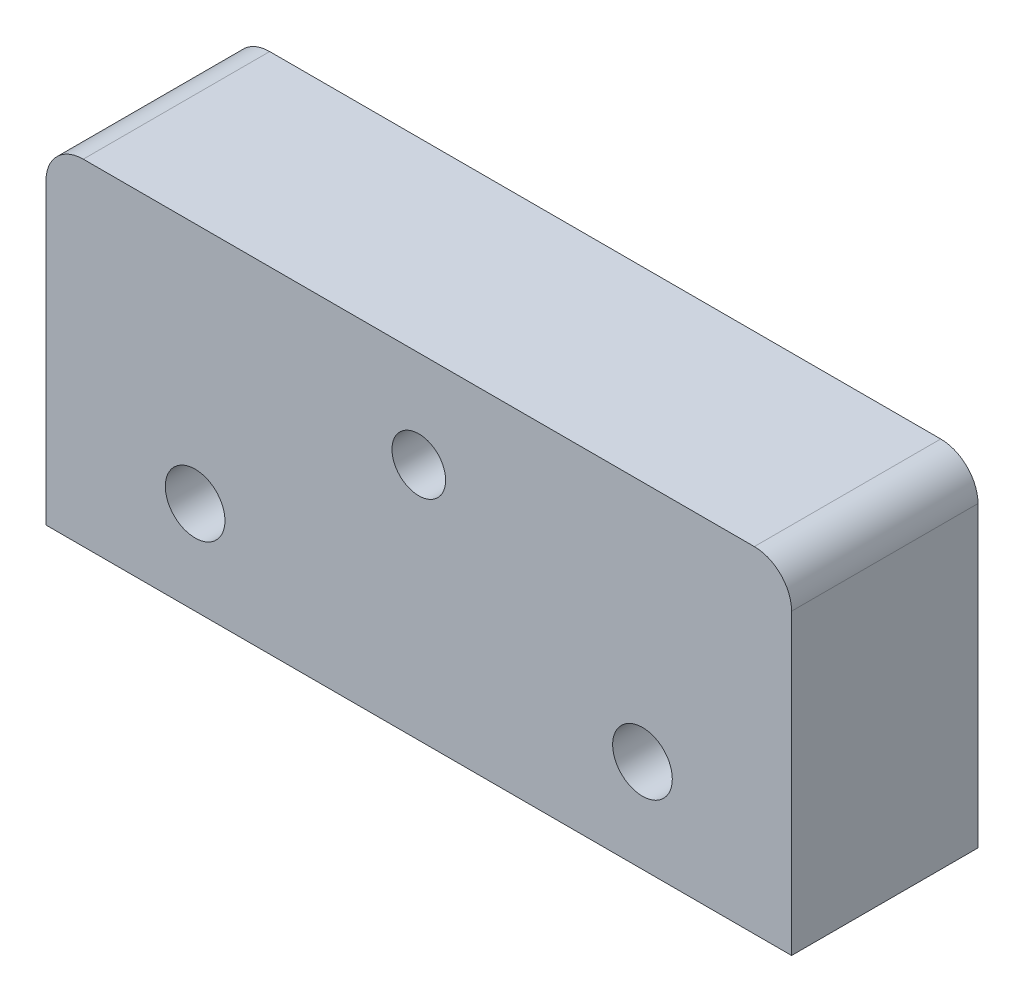
ISO-10303-21;
HEADER;
FILE_DESCRIPTION(('STEP AP214'),'2;1');
FILE_NAME('part.step','',(''),(''),'','','');
FILE_SCHEMA(('AUTOMOTIVE_DESIGN { 1 0 10303 214 1 1 1 1 }'));
ENDSEC;
DATA;
#1=APPLICATION_CONTEXT('core data for automotive mechanical design processes');
#2=APPLICATION_PROTOCOL_DEFINITION('international standard','automotive_design',2000,#1);
#3=PRODUCT_CONTEXT('',#1,'mechanical');
#4=PRODUCT('Part','Part','',(#3));
#5=PRODUCT_RELATED_PRODUCT_CATEGORY('part','',(#4));
#6=PRODUCT_DEFINITION_FORMATION('','',#4);
#7=PRODUCT_DEFINITION_CONTEXT('part definition',#1,'design');
#8=PRODUCT_DEFINITION('design','',#6,#7);
#9=PRODUCT_DEFINITION_SHAPE('','',#8);
#10=(LENGTH_UNIT() NAMED_UNIT(*) SI_UNIT(.MILLI.,.METRE.));
#11=(NAMED_UNIT(*) PLANE_ANGLE_UNIT() SI_UNIT($,.RADIAN.));
#12=(NAMED_UNIT(*) SI_UNIT($,.STERADIAN.) SOLID_ANGLE_UNIT());
#13=UNCERTAINTY_MEASURE_WITH_UNIT(LENGTH_MEASURE(1.E-05),#10,'distance_accuracy_value','');
#14=(GEOMETRIC_REPRESENTATION_CONTEXT(3) GLOBAL_UNCERTAINTY_ASSIGNED_CONTEXT((#13)) GLOBAL_UNIT_ASSIGNED_CONTEXT((#10,
#11,#12)) REPRESENTATION_CONTEXT('',''));
#15=CARTESIAN_POINT('',(0.,0.,0.));
#16=DIRECTION('',(0.,0.,1.));
#17=DIRECTION('',(1.,0.,0.));
#18=AXIS2_PLACEMENT_3D('',#15,#16,#17);
#19=CARTESIAN_POINT('',(0.,45.,25.));
#20=DIRECTION('',(0.,-1.,0.));
#21=DIRECTION('',(0.,0.,-1.));
#22=AXIS2_PLACEMENT_3D('',#19,#20,#21);
#23=PLANE('',#22);
#24=DIRECTION('',(-1.,0.,0.));
#25=VECTOR('',#24,1.);
#26=CARTESIAN_POINT('',(0.,45.,25.));
#27=LINE('',#26,#25);
#28=CARTESIAN_POINT('',(95.,45.,25.));
#29=VERTEX_POINT('',#28);
#30=CARTESIAN_POINT('',(5.,45.,25.));
#31=VERTEX_POINT('',#30);
#32=EDGE_CURVE('E99',#29,#31,#27,.T.);
#33=ORIENTED_EDGE('',*,*,#32,.F.);
#34=DIRECTION('',(0.,0.,-1.));
#35=VECTOR('',#34,1.);
#36=CARTESIAN_POINT('',(95.,45.,25.));
#37=LINE('',#36,#35);
#38=CARTESIAN_POINT('',(95.,45.,0.));
#39=VERTEX_POINT('',#38);
#40=EDGE_CURVE('E141',#29,#39,#37,.T.);
#41=ORIENTED_EDGE('',*,*,#40,.T.);
#42=DIRECTION('',(-1.,0.,0.));
#43=VECTOR('',#42,1.);
#44=CARTESIAN_POINT('',(0.,45.,0.));
#45=LINE('',#44,#43);
#46=CARTESIAN_POINT('',(5.,45.,0.));
#47=VERTEX_POINT('',#46);
#48=EDGE_CURVE('E127',#39,#47,#45,.T.);
#49=ORIENTED_EDGE('',*,*,#48,.T.);
#50=DIRECTION('',(0.,0.,-1.));
#51=VECTOR('',#50,1.);
#52=CARTESIAN_POINT('',(5.,45.,25.));
#53=LINE('',#52,#51);
#54=EDGE_CURVE('E108',#47,#31,#53,.F.);
#55=ORIENTED_EDGE('',*,*,#54,.T.);
#56=EDGE_LOOP('',(#33,#41,#49,#55));
#57=FACE_BOUND('',#56,.T.);
#58=ADVANCED_FACE('F35',(#57),#23,.F.);
#59=CARTESIAN_POINT('',(0.,0.,25.));
#60=DIRECTION('',(1.,0.,0.));
#61=DIRECTION('',(0.,0.,-1.));
#62=AXIS2_PLACEMENT_3D('',#59,#60,#61);
#63=PLANE('',#62);
#64=DIRECTION('',(0.,-1.,0.));
#65=VECTOR('',#64,1.);
#66=CARTESIAN_POINT('',(0.,0.,25.));
#67=LINE('',#66,#65);
#68=CARTESIAN_POINT('',(0.,40.,25.));
#69=VERTEX_POINT('',#68);
#70=CARTESIAN_POINT('',(0.,0.,25.));
#71=VERTEX_POINT('',#70);
#72=EDGE_CURVE('E90',#69,#71,#67,.T.);
#73=ORIENTED_EDGE('',*,*,#72,.F.);
#74=DIRECTION('',(0.,0.,-1.));
#75=VECTOR('',#74,1.);
#76=CARTESIAN_POINT('',(0.,40.,25.));
#77=LINE('',#76,#75);
#78=CARTESIAN_POINT('',(0.,40.,0.));
#79=VERTEX_POINT('',#78);
#80=EDGE_CURVE('E11',#69,#79,#77,.T.);
#81=ORIENTED_EDGE('',*,*,#80,.T.);
#82=DIRECTION('',(0.,-1.,0.));
#83=VECTOR('',#82,1.);
#84=CARTESIAN_POINT('',(0.,0.,0.));
#85=LINE('',#84,#83);
#86=CARTESIAN_POINT('',(0.,0.,0.));
#87=VERTEX_POINT('',#86);
#88=EDGE_CURVE('E105',#79,#87,#85,.T.);
#89=ORIENTED_EDGE('',*,*,#88,.T.);
#90=DIRECTION('',(0.,0.,-1.));
#91=VECTOR('',#90,1.);
#92=CARTESIAN_POINT('',(0.,0.,25.));
#93=LINE('',#92,#91);
#94=EDGE_CURVE('E102',#71,#87,#93,.T.);
#95=ORIENTED_EDGE('',*,*,#94,.F.);
#96=EDGE_LOOP('',(#73,#81,#89,#95));
#97=FACE_BOUND('',#96,.T.);
#98=ADVANCED_FACE('F103',(#97),#63,.F.);
#99=CARTESIAN_POINT('',(0.,0.,25.));
#100=DIRECTION('',(0.,1.,0.));
#101=DIRECTION('',(0.,0.,1.));
#102=AXIS2_PLACEMENT_3D('',#99,#100,#101);
#103=PLANE('',#102);
#104=DIRECTION('',(1.,0.,0.));
#105=VECTOR('',#104,1.);
#106=CARTESIAN_POINT('',(0.,0.,0.));
#107=LINE('',#106,#105);
#108=CARTESIAN_POINT('',(100.,0.,0.));
#109=VERTEX_POINT('',#108);
#110=EDGE_CURVE('E132',#87,#109,#107,.T.);
#111=ORIENTED_EDGE('',*,*,#110,.T.);
#112=DIRECTION('',(0.,0.,-1.));
#113=VECTOR('',#112,1.);
#114=CARTESIAN_POINT('',(100.,0.,25.));
#115=LINE('',#114,#113);
#116=CARTESIAN_POINT('',(100.,0.,25.));
#117=VERTEX_POINT('',#116);
#118=EDGE_CURVE('E109',#117,#109,#115,.T.);
#119=ORIENTED_EDGE('',*,*,#118,.F.);
#120=DIRECTION('',(1.,0.,0.));
#121=VECTOR('',#120,1.);
#122=CARTESIAN_POINT('',(0.,0.,25.));
#123=LINE('',#122,#121);
#124=EDGE_CURVE('E95',#71,#117,#123,.T.);
#125=ORIENTED_EDGE('',*,*,#124,.F.);
#126=ORIENTED_EDGE('',*,*,#94,.T.);
#127=EDGE_LOOP('',(#111,#119,#125,#126));
#128=FACE_BOUND('',#127,.T.);
#129=ADVANCED_FACE('F111',(#128),#103,.F.);
#130=CARTESIAN_POINT('',(50.,32.,25.));
#131=DIRECTION('',(0.,0.,-1.));
#132=DIRECTION('',(-1.,0.,0.));
#133=AXIS2_PLACEMENT_3D('',#130,#131,#132);
#134=CYLINDRICAL_SURFACE('',#133,3.6);
#135=CARTESIAN_POINT('',(50.,32.,7.5));
#136=DIRECTION('',(0.,0.,1.));
#137=DIRECTION('',(1.,0.,0.));
#138=AXIS2_PLACEMENT_3D('',#135,#136,#137);
#139=CIRCLE('',#138,3.6);
#140=CARTESIAN_POINT('',(53.6,32.,7.5));
#141=VERTEX_POINT('',#140);
#142=EDGE_CURVE('E130',#141,#141,#139,.T.);
#143=ORIENTED_EDGE('',*,*,#142,.F.);
#144=EDGE_LOOP('',(#143));
#145=FACE_BOUND('',#144,.T.);
#146=CARTESIAN_POINT('',(50.,32.,25.));
#147=DIRECTION('',(0.,0.,1.));
#148=DIRECTION('',(1.,0.,0.));
#149=AXIS2_PLACEMENT_3D('',#146,#147,#148);
#150=CIRCLE('',#149,3.6);
#151=CARTESIAN_POINT('',(53.6,32.,25.));
#152=VERTEX_POINT('',#151);
#153=EDGE_CURVE('E121',#152,#152,#150,.T.);
#154=ORIENTED_EDGE('',*,*,#153,.T.);
#155=EDGE_LOOP('',(#154));
#156=FACE_BOUND('',#155,.T.);
#157=ADVANCED_FACE('F218',(#145,#156),#134,.F.);
#158=CARTESIAN_POINT('',(80.,12.5,25.));
#159=DIRECTION('',(0.,0.,-1.));
#160=DIRECTION('',(-1.,0.,0.));
#161=AXIS2_PLACEMENT_3D('',#158,#159,#160);
#162=CYLINDRICAL_SURFACE('',#161,4.00000000000001);
#163=CARTESIAN_POINT('',(80.,12.5,8.));
#164=DIRECTION('',(0.,0.,1.));
#165=DIRECTION('',(1.,0.,0.));
#166=AXIS2_PLACEMENT_3D('',#163,#164,#165);
#167=CIRCLE('',#166,4.00000000000001);
#168=CARTESIAN_POINT('',(84.,12.5,8.));
#169=VERTEX_POINT('',#168);
#170=EDGE_CURVE('E150',#169,#169,#167,.T.);
#171=ORIENTED_EDGE('',*,*,#170,.F.);
#172=EDGE_LOOP('',(#171));
#173=FACE_BOUND('',#172,.T.);
#174=CARTESIAN_POINT('',(80.,12.5,25.));
#175=DIRECTION('',(0.,0.,1.));
#176=DIRECTION('',(1.,0.,0.));
#177=AXIS2_PLACEMENT_3D('',#174,#175,#176);
#178=CIRCLE('',#177,4.00000000000001);
#179=CARTESIAN_POINT('',(84.,12.5,25.));
#180=VERTEX_POINT('',#179);
#181=EDGE_CURVE('E115',#180,#180,#178,.T.);
#182=ORIENTED_EDGE('',*,*,#181,.T.);
#183=EDGE_LOOP('',(#182));
#184=FACE_BOUND('',#183,.T.);
#185=ADVANCED_FACE('F221',(#173,#184),#162,.F.);
#186=CARTESIAN_POINT('',(100.,0.,25.));
#187=DIRECTION('',(-1.,0.,0.));
#188=DIRECTION('',(0.,0.,1.));
#189=AXIS2_PLACEMENT_3D('',#186,#187,#188);
#190=PLANE('',#189);
#191=DIRECTION('',(0.,1.,0.));
#192=VECTOR('',#191,1.);
#193=CARTESIAN_POINT('',(100.,0.,0.));
#194=LINE('',#193,#192);
#195=CARTESIAN_POINT('',(100.,40.,0.));
#196=VERTEX_POINT('',#195);
#197=EDGE_CURVE('E134',#109,#196,#194,.T.);
#198=ORIENTED_EDGE('',*,*,#197,.T.);
#199=DIRECTION('',(0.,0.,-1.));
#200=VECTOR('',#199,1.);
#201=CARTESIAN_POINT('',(100.,40.,25.));
#202=LINE('',#201,#200);
#203=CARTESIAN_POINT('',(100.,40.,25.));
#204=VERTEX_POINT('',#203);
#205=EDGE_CURVE('E60',#196,#204,#202,.F.);
#206=ORIENTED_EDGE('',*,*,#205,.T.);
#207=DIRECTION('',(0.,1.,0.));
#208=VECTOR('',#207,1.);
#209=CARTESIAN_POINT('',(100.,0.,25.));
#210=LINE('',#209,#208);
#211=EDGE_CURVE('E113',#117,#204,#210,.T.);
#212=ORIENTED_EDGE('',*,*,#211,.F.);
#213=ORIENTED_EDGE('',*,*,#118,.T.);
#214=EDGE_LOOP('',(#198,#206,#212,#213));
#215=FACE_BOUND('',#214,.T.);
#216=ADVANCED_FACE('F180',(#215),#190,.F.);
#217=CARTESIAN_POINT('',(20.,12.5,25.));
#218=DIRECTION('',(0.,0.,-1.));
#219=DIRECTION('',(-1.,0.,0.));
#220=AXIS2_PLACEMENT_3D('',#217,#218,#219);
#221=CYLINDRICAL_SURFACE('',#220,4.);
#222=CARTESIAN_POINT('',(20.,12.5,8.));
#223=DIRECTION('',(0.,0.,1.));
#224=DIRECTION('',(1.,0.,0.));
#225=AXIS2_PLACEMENT_3D('',#222,#223,#224);
#226=CIRCLE('',#225,4.);
#227=CARTESIAN_POINT('',(24.,12.5,8.));
#228=VERTEX_POINT('',#227);
#229=EDGE_CURVE('E39',#228,#228,#226,.T.);
#230=ORIENTED_EDGE('',*,*,#229,.F.);
#231=EDGE_LOOP('',(#230));
#232=FACE_BOUND('',#231,.T.);
#233=CARTESIAN_POINT('',(20.,12.5,25.));
#234=DIRECTION('',(0.,0.,1.));
#235=DIRECTION('',(1.,0.,0.));
#236=AXIS2_PLACEMENT_3D('',#233,#234,#235);
#237=CIRCLE('',#236,4.);
#238=CARTESIAN_POINT('',(24.,12.5,25.));
#239=VERTEX_POINT('',#238);
#240=EDGE_CURVE('E124',#239,#239,#237,.T.);
#241=ORIENTED_EDGE('',*,*,#240,.T.);
#242=EDGE_LOOP('',(#241));
#243=FACE_BOUND('',#242,.T.);
#244=ADVANCED_FACE('F211',(#232,#243),#221,.F.);
#245=CARTESIAN_POINT('',(0.,0.,25.));
#246=DIRECTION('',(0.,0.,1.));
#247=DIRECTION('',(1.,0.,0.));
#248=AXIS2_PLACEMENT_3D('',#245,#246,#247);
#249=PLANE('',#248);
#250=ORIENTED_EDGE('',*,*,#211,.T.);
#251=CARTESIAN_POINT('',(95.,40.,25.));
#252=DIRECTION('',(0.,0.,1.));
#253=DIRECTION('',(1.,0.,0.));
#254=AXIS2_PLACEMENT_3D('',#251,#252,#253);
#255=CIRCLE('',#254,5.);
#256=EDGE_CURVE('E44',#204,#29,#255,.T.);
#257=ORIENTED_EDGE('',*,*,#256,.T.);
#258=ORIENTED_EDGE('',*,*,#32,.T.);
#259=CARTESIAN_POINT('',(5.,40.,25.));
#260=DIRECTION('',(0.,0.,1.));
#261=DIRECTION('',(1.,0.,0.));
#262=AXIS2_PLACEMENT_3D('',#259,#260,#261);
#263=CIRCLE('',#262,5.);
#264=EDGE_CURVE('E52',#31,#69,#263,.T.);
#265=ORIENTED_EDGE('',*,*,#264,.T.);
#266=ORIENTED_EDGE('',*,*,#72,.T.);
#267=ORIENTED_EDGE('',*,*,#124,.T.);
#268=EDGE_LOOP('',(#250,#257,#258,#265,#266,#267));
#269=FACE_BOUND('',#268,.T.);
#270=ORIENTED_EDGE('',*,*,#181,.F.);
#271=EDGE_LOOP('',(#270));
#272=FACE_BOUND('',#271,.T.);
#273=ORIENTED_EDGE('',*,*,#153,.F.);
#274=EDGE_LOOP('',(#273));
#275=FACE_BOUND('',#274,.T.);
#276=ORIENTED_EDGE('',*,*,#240,.F.);
#277=EDGE_LOOP('',(#276));
#278=FACE_BOUND('',#277,.T.);
#279=ADVANCED_FACE('F92',(#269,#272,#275,#278),#249,.T.);
#280=CARTESIAN_POINT('',(0.,0.,0.));
#281=DIRECTION('',(0.,0.,1.));
#282=DIRECTION('',(1.,0.,0.));
#283=AXIS2_PLACEMENT_3D('',#280,#281,#282);
#284=PLANE('',#283);
#285=CARTESIAN_POINT('',(20.,12.5,0.));
#286=DIRECTION('',(0.,0.,1.));
#287=DIRECTION('',(1.,0.,0.));
#288=AXIS2_PLACEMENT_3D('',#285,#286,#287);
#289=CIRCLE('',#288,7.);
#290=CARTESIAN_POINT('',(27.,12.5,0.));
#291=VERTEX_POINT('',#290);
#292=EDGE_CURVE('E358',#291,#291,#289,.T.);
#293=ORIENTED_EDGE('',*,*,#292,.T.);
#294=EDGE_LOOP('',(#293));
#295=FACE_BOUND('',#294,.T.);
#296=CARTESIAN_POINT('',(80.,12.5,0.));
#297=DIRECTION('',(0.,0.,1.));
#298=DIRECTION('',(1.,0.,0.));
#299=AXIS2_PLACEMENT_3D('',#296,#297,#298);
#300=CIRCLE('',#299,7.);
#301=CARTESIAN_POINT('',(87.,12.5,0.));
#302=VERTEX_POINT('',#301);
#303=EDGE_CURVE('E159',#302,#302,#300,.T.);
#304=ORIENTED_EDGE('',*,*,#303,.T.);
#305=EDGE_LOOP('',(#304));
#306=FACE_BOUND('',#305,.T.);
#307=CARTESIAN_POINT('',(50.,32.,0.));
#308=DIRECTION('',(0.,0.,1.));
#309=DIRECTION('',(1.,0.,0.));
#310=AXIS2_PLACEMENT_3D('',#307,#308,#309);
#311=CIRCLE('',#310,11.);
#312=CARTESIAN_POINT('',(61.,32.,0.));
#313=VERTEX_POINT('',#312);
#314=EDGE_CURVE('E152',#313,#313,#311,.T.);
#315=ORIENTED_EDGE('',*,*,#314,.T.);
#316=EDGE_LOOP('',(#315));
#317=FACE_BOUND('',#316,.T.);
#318=ORIENTED_EDGE('',*,*,#48,.F.);
#319=CARTESIAN_POINT('',(95.,40.,0.));
#320=DIRECTION('',(0.,0.,1.));
#321=DIRECTION('',(1.,0.,0.));
#322=AXIS2_PLACEMENT_3D('',#319,#320,#321);
#323=CIRCLE('',#322,5.);
#324=EDGE_CURVE('E146',#39,#196,#323,.F.);
#325=ORIENTED_EDGE('',*,*,#324,.T.);
#326=ORIENTED_EDGE('',*,*,#197,.F.);
#327=ORIENTED_EDGE('',*,*,#110,.F.);
#328=ORIENTED_EDGE('',*,*,#88,.F.);
#329=CARTESIAN_POINT('',(5.,40.,0.));
#330=DIRECTION('',(0.,0.,1.));
#331=DIRECTION('',(1.,0.,0.));
#332=AXIS2_PLACEMENT_3D('',#329,#330,#331);
#333=CIRCLE('',#332,5.);
#334=EDGE_CURVE('E144',#79,#47,#333,.F.);
#335=ORIENTED_EDGE('',*,*,#334,.T.);
#336=EDGE_LOOP('',(#318,#325,#326,#327,#328,#335));
#337=FACE_BOUND('',#336,.T.);
#338=ADVANCED_FACE('F178',(#295,#306,#317,#337),#284,.F.);
#339=CARTESIAN_POINT('',(50.,32.,7.5));
#340=DIRECTION('',(0.,0.,-1.));
#341=DIRECTION('',(-1.,0.,0.));
#342=AXIS2_PLACEMENT_3D('',#339,#340,#341);
#343=CYLINDRICAL_SURFACE('',#342,11.);
#344=CARTESIAN_POINT('',(50.,32.,7.5));
#345=DIRECTION('',(0.,0.,1.));
#346=DIRECTION('',(1.,0.,0.));
#347=AXIS2_PLACEMENT_3D('',#344,#345,#346);
#348=CIRCLE('',#347,11.);
#349=CARTESIAN_POINT('',(61.,32.,7.5));
#350=VERTEX_POINT('',#349);
#351=EDGE_CURVE('E139',#350,#350,#348,.T.);
#352=ORIENTED_EDGE('',*,*,#351,.T.);
#353=EDGE_LOOP('',(#352));
#354=FACE_BOUND('',#353,.T.);
#355=ORIENTED_EDGE('',*,*,#314,.F.);
#356=EDGE_LOOP('',(#355));
#357=FACE_BOUND('',#356,.T.);
#358=ADVANCED_FACE('F197',(#354,#357),#343,.F.);
#359=CARTESIAN_POINT('',(50.,32.,7.5));
#360=DIRECTION('',(0.,0.,1.));
#361=DIRECTION('',(1.,0.,0.));
#362=AXIS2_PLACEMENT_3D('',#359,#360,#361);
#363=PLANE('',#362);
#364=ORIENTED_EDGE('',*,*,#142,.T.);
#365=EDGE_LOOP('',(#364));
#366=FACE_BOUND('',#365,.T.);
#367=ORIENTED_EDGE('',*,*,#351,.F.);
#368=EDGE_LOOP('',(#367));
#369=FACE_BOUND('',#368,.T.);
#370=ADVANCED_FACE('F191',(#366,#369),#363,.F.);
#371=CARTESIAN_POINT('',(95.,40.,25.));
#372=DIRECTION('',(0.,0.,-1.));
#373=DIRECTION('',(-1.,0.,0.));
#374=AXIS2_PLACEMENT_3D('',#371,#372,#373);
#375=CYLINDRICAL_SURFACE('',#374,5.);
#376=ORIENTED_EDGE('',*,*,#256,.F.);
#377=ORIENTED_EDGE('',*,*,#205,.F.);
#378=ORIENTED_EDGE('',*,*,#324,.F.);
#379=ORIENTED_EDGE('',*,*,#40,.F.);
#380=EDGE_LOOP('',(#376,#377,#378,#379));
#381=FACE_BOUND('',#380,.T.);
#382=ADVANCED_FACE('F182',(#381),#375,.T.);
#383=CARTESIAN_POINT('',(5.,40.,25.));
#384=DIRECTION('',(0.,0.,-1.));
#385=DIRECTION('',(-1.,0.,0.));
#386=AXIS2_PLACEMENT_3D('',#383,#384,#385);
#387=CYLINDRICAL_SURFACE('',#386,5.);
#388=ORIENTED_EDGE('',*,*,#264,.F.);
#389=ORIENTED_EDGE('',*,*,#54,.F.);
#390=ORIENTED_EDGE('',*,*,#334,.F.);
#391=ORIENTED_EDGE('',*,*,#80,.F.);
#392=EDGE_LOOP('',(#388,#389,#390,#391));
#393=FACE_BOUND('',#392,.T.);
#394=ADVANCED_FACE('F37',(#393),#387,.T.);
#395=CARTESIAN_POINT('',(80.,12.5,8.));
#396=DIRECTION('',(0.,0.,-1.));
#397=DIRECTION('',(-1.,0.,0.));
#398=AXIS2_PLACEMENT_3D('',#395,#396,#397);
#399=CYLINDRICAL_SURFACE('',#398,7.);
#400=CARTESIAN_POINT('',(80.,12.5,8.));
#401=DIRECTION('',(0.,0.,1.));
#402=DIRECTION('',(1.,0.,0.));
#403=AXIS2_PLACEMENT_3D('',#400,#401,#402);
#404=CIRCLE('',#403,7.);
#405=CARTESIAN_POINT('',(87.,12.5,8.));
#406=VERTEX_POINT('',#405);
#407=EDGE_CURVE('E153',#406,#406,#404,.T.);
#408=ORIENTED_EDGE('',*,*,#407,.T.);
#409=EDGE_LOOP('',(#408));
#410=FACE_BOUND('',#409,.T.);
#411=ORIENTED_EDGE('',*,*,#303,.F.);
#412=EDGE_LOOP('',(#411));
#413=FACE_BOUND('',#412,.T.);
#414=ADVANCED_FACE('F196',(#410,#413),#399,.F.);
#415=CARTESIAN_POINT('',(80.,12.5,8.));
#416=DIRECTION('',(0.,0.,1.));
#417=DIRECTION('',(1.,0.,0.));
#418=AXIS2_PLACEMENT_3D('',#415,#416,#417);
#419=PLANE('',#418);
#420=ORIENTED_EDGE('',*,*,#170,.T.);
#421=EDGE_LOOP('',(#420));
#422=FACE_BOUND('',#421,.T.);
#423=ORIENTED_EDGE('',*,*,#407,.F.);
#424=EDGE_LOOP('',(#423));
#425=FACE_BOUND('',#424,.T.);
#426=ADVANCED_FACE('F323',(#422,#425),#419,.F.);
#427=CARTESIAN_POINT('',(20.,12.5,8.));
#428=DIRECTION('',(0.,0.,-1.));
#429=DIRECTION('',(-1.,0.,0.));
#430=AXIS2_PLACEMENT_3D('',#427,#428,#429);
#431=CYLINDRICAL_SURFACE('',#430,7.);
#432=CARTESIAN_POINT('',(20.,12.5,8.));
#433=DIRECTION('',(0.,0.,1.));
#434=DIRECTION('',(1.,0.,0.));
#435=AXIS2_PLACEMENT_3D('',#432,#433,#434);
#436=CIRCLE('',#435,7.);
#437=CARTESIAN_POINT('',(27.,12.5,8.));
#438=VERTEX_POINT('',#437);
#439=EDGE_CURVE('E166',#438,#438,#436,.T.);
#440=ORIENTED_EDGE('',*,*,#439,.T.);
#441=EDGE_LOOP('',(#440));
#442=FACE_BOUND('',#441,.T.);
#443=ORIENTED_EDGE('',*,*,#292,.F.);
#444=EDGE_LOOP('',(#443));
#445=FACE_BOUND('',#444,.T.);
#446=ADVANCED_FACE('F330',(#442,#445),#431,.F.);
#447=CARTESIAN_POINT('',(20.,12.5,8.));
#448=DIRECTION('',(0.,0.,1.));
#449=DIRECTION('',(1.,0.,0.));
#450=AXIS2_PLACEMENT_3D('',#447,#448,#449);
#451=PLANE('',#450);
#452=ORIENTED_EDGE('',*,*,#229,.T.);
#453=EDGE_LOOP('',(#452));
#454=FACE_BOUND('',#453,.T.);
#455=ORIENTED_EDGE('',*,*,#439,.F.);
#456=EDGE_LOOP('',(#455));
#457=FACE_BOUND('',#456,.T.);
#458=ADVANCED_FACE('F337',(#454,#457),#451,.F.);
#459=CLOSED_SHELL('',(#58,#98,#129,#157,#185,#216,#244,#279,#338,#358,#370,#382,#394,#414,#426,
#446,#458));
#460=MANIFOLD_SOLID_BREP('B2',#459);
#461=ADVANCED_BREP_SHAPE_REPRESENTATION('',(#18,#460),#14);
#462=SHAPE_DEFINITION_REPRESENTATION(#9,#461);
ENDSEC;
END-ISO-10303-21;
